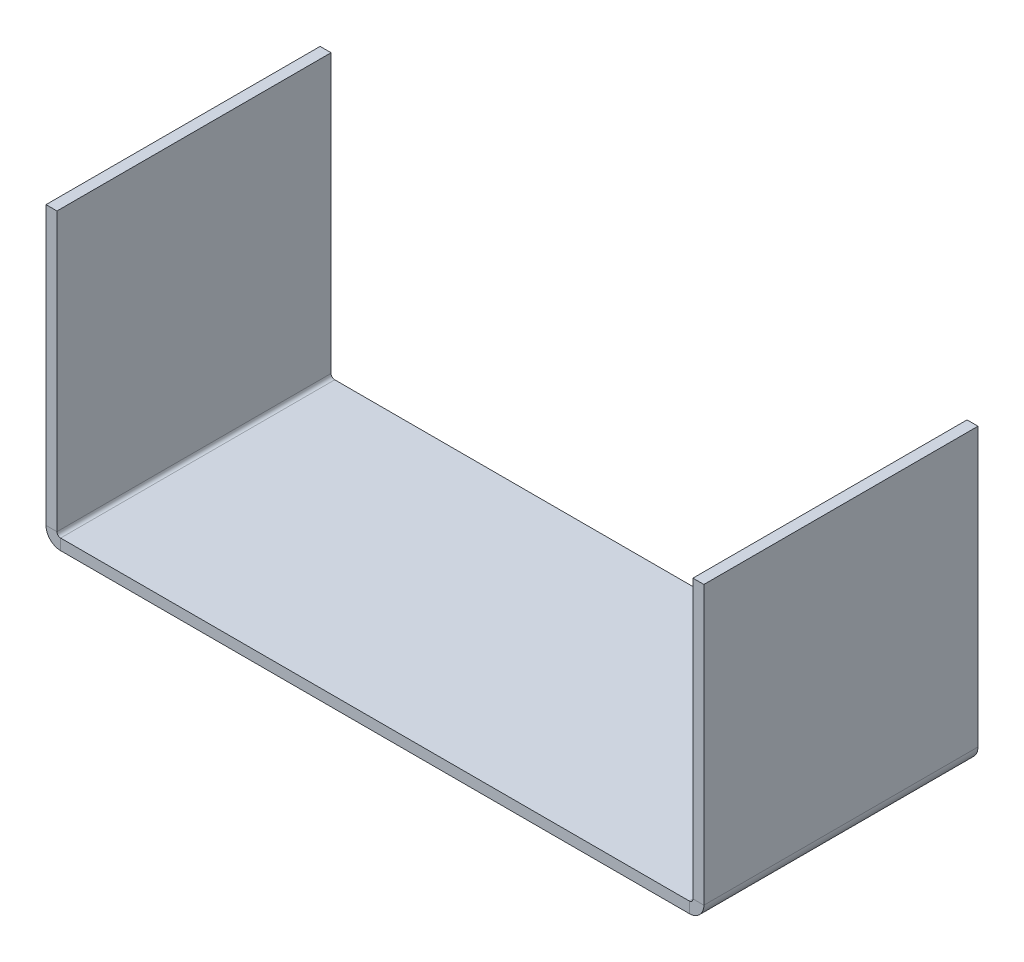
ISO-10303-21;
HEADER;
FILE_DESCRIPTION(('STEP AP214'),'2;1');
FILE_NAME('part.step','',(''),(''),'','','');
FILE_SCHEMA(('AUTOMOTIVE_DESIGN { 1 0 10303 214 1 1 1 1 }'));
ENDSEC;
DATA;
#1=APPLICATION_CONTEXT('core data for automotive mechanical design processes');
#2=APPLICATION_PROTOCOL_DEFINITION('international standard','automotive_design',2000,#1);
#3=PRODUCT_CONTEXT('',#1,'mechanical');
#4=PRODUCT('Part','Part','',(#3));
#5=PRODUCT_RELATED_PRODUCT_CATEGORY('part','',(#4));
#6=PRODUCT_DEFINITION_FORMATION('','',#4);
#7=PRODUCT_DEFINITION_CONTEXT('part definition',#1,'design');
#8=PRODUCT_DEFINITION('design','',#6,#7);
#9=PRODUCT_DEFINITION_SHAPE('','',#8);
#10=(LENGTH_UNIT() NAMED_UNIT(*) SI_UNIT(.MILLI.,.METRE.));
#11=(NAMED_UNIT(*) PLANE_ANGLE_UNIT() SI_UNIT($,.RADIAN.));
#12=(NAMED_UNIT(*) SI_UNIT($,.STERADIAN.) SOLID_ANGLE_UNIT());
#13=UNCERTAINTY_MEASURE_WITH_UNIT(LENGTH_MEASURE(1.E-05),#10,'distance_accuracy_value','');
#14=(GEOMETRIC_REPRESENTATION_CONTEXT(3) GLOBAL_UNCERTAINTY_ASSIGNED_CONTEXT((#13)) GLOBAL_UNIT_ASSIGNED_CONTEXT((#10,
#11,#12)) REPRESENTATION_CONTEXT('',''));
#15=CARTESIAN_POINT('',(0.,0.,0.));
#16=DIRECTION('',(0.,0.,1.));
#17=DIRECTION('',(1.,0.,0.));
#18=AXIS2_PLACEMENT_3D('',#15,#16,#17);
#19=CARTESIAN_POINT('',(-90.,4.,75.));
#20=DIRECTION('',(0.,0.,1.));
#21=DIRECTION('',(1.,0.,0.));
#22=AXIS2_PLACEMENT_3D('',#19,#20,#21);
#23=PLANE('',#22);
#24=DIRECTION('',(1.,0.,0.));
#25=VECTOR('',#24,1.);
#26=CARTESIAN_POINT('',(-90.,4.,75.));
#27=LINE('',#26,#25);
#28=CARTESIAN_POINT('',(-90.,4.,75.));
#29=VERTEX_POINT('',#28);
#30=CARTESIAN_POINT('',(-87.,4.,75.));
#31=VERTEX_POINT('',#30);
#32=EDGE_CURVE('E13',#29,#31,#27,.T.);
#33=ORIENTED_EDGE('',*,*,#32,.F.);
#34=CARTESIAN_POINT('',(-86.,4.,75.));
#35=DIRECTION('',(0.,0.,-1.));
#36=DIRECTION('',(-1.,0.,0.));
#37=AXIS2_PLACEMENT_3D('',#34,#35,#36);
#38=CIRCLE('',#37,4.);
#39=CARTESIAN_POINT('',(-85.9999999999999,0.,75.));
#40=VERTEX_POINT('',#39);
#41=EDGE_CURVE('E160',#29,#40,#38,.F.);
#42=ORIENTED_EDGE('',*,*,#41,.T.);
#43=DIRECTION('',(0.,-1.,0.));
#44=VECTOR('',#43,1.);
#45=CARTESIAN_POINT('',(-85.9999999999999,3.,75.));
#46=LINE('',#45,#44);
#47=CARTESIAN_POINT('',(-85.9999999999999,3.,75.));
#48=VERTEX_POINT('',#47);
#49=EDGE_CURVE('E58',#48,#40,#46,.T.);
#50=ORIENTED_EDGE('',*,*,#49,.F.);
#51=CARTESIAN_POINT('',(-86.,4.,75.));
#52=DIRECTION('',(0.,0.,1.));
#53=DIRECTION('',(1.,0.,0.));
#54=AXIS2_PLACEMENT_3D('',#51,#52,#53);
#55=CIRCLE('',#54,1.);
#56=EDGE_CURVE('E254',#31,#48,#55,.T.);
#57=ORIENTED_EDGE('',*,*,#56,.F.);
#58=EDGE_LOOP('',(#33,#42,#50,#57));
#59=FACE_BOUND('',#58,.T.);
#60=ADVANCED_FACE('F50',(#59),#23,.T.);
#61=CARTESIAN_POINT('',(-85.9999999999999,3.,75.));
#62=DIRECTION('',(0.,0.,1.));
#63=DIRECTION('',(1.,0.,0.));
#64=AXIS2_PLACEMENT_3D('',#61,#62,#63);
#65=PLANE('',#64);
#66=DIRECTION('',(0.,-1.,0.));
#67=VECTOR('',#66,1.);
#68=CARTESIAN_POINT('',(-90.,0.,75.));
#69=LINE('',#68,#67);
#70=CARTESIAN_POINT('',(-90.,80.,75.));
#71=VERTEX_POINT('',#70);
#72=EDGE_CURVE('E165',#71,#29,#69,.T.);
#73=ORIENTED_EDGE('',*,*,#72,.T.);
#74=ORIENTED_EDGE('',*,*,#32,.T.);
#75=DIRECTION('',(0.,1.,0.));
#76=VECTOR('',#75,1.);
#77=CARTESIAN_POINT('',(-87.,0.,75.));
#78=LINE('',#77,#76);
#79=CARTESIAN_POINT('',(-87.,80.,75.));
#80=VERTEX_POINT('',#79);
#81=EDGE_CURVE('E267',#80,#31,#78,.F.);
#82=ORIENTED_EDGE('',*,*,#81,.F.);
#83=DIRECTION('',(1.,0.,0.));
#84=VECTOR('',#83,1.);
#85=CARTESIAN_POINT('',(-90.,80.,75.));
#86=LINE('',#85,#84);
#87=EDGE_CURVE('E269',#71,#80,#86,.T.);
#88=ORIENTED_EDGE('',*,*,#87,.F.);
#89=EDGE_LOOP('',(#73,#74,#82,#88));
#90=FACE_BOUND('',#89,.T.);
#91=ADVANCED_FACE('F280',(#90),#65,.T.);
#92=CARTESIAN_POINT('',(-85.9999999999999,0.,0.));
#93=DIRECTION('',(0.,0.,-1.));
#94=DIRECTION('',(-1.,0.,0.));
#95=AXIS2_PLACEMENT_3D('',#92,#93,#94);
#96=PLANE('',#95);
#97=DIRECTION('',(0.,1.,0.));
#98=VECTOR('',#97,1.);
#99=CARTESIAN_POINT('',(-85.9999999999999,0.,0.));
#100=LINE('',#99,#98);
#101=CARTESIAN_POINT('',(-85.9999999999999,0.,0.));
#102=VERTEX_POINT('',#101);
#103=CARTESIAN_POINT('',(-85.9999999999999,3.,0.));
#104=VERTEX_POINT('',#103);
#105=EDGE_CURVE('E158',#102,#104,#100,.T.);
#106=ORIENTED_EDGE('',*,*,#105,.F.);
#107=CARTESIAN_POINT('',(-86.,4.,0.));
#108=DIRECTION('',(0.,0.,-1.));
#109=DIRECTION('',(-1.,0.,0.));
#110=AXIS2_PLACEMENT_3D('',#107,#108,#109);
#111=CIRCLE('',#110,4.);
#112=CARTESIAN_POINT('',(-90.,4.,0.));
#113=VERTEX_POINT('',#112);
#114=EDGE_CURVE('E172',#113,#102,#111,.F.);
#115=ORIENTED_EDGE('',*,*,#114,.F.);
#116=DIRECTION('',(-1.,0.,0.));
#117=VECTOR('',#116,1.);
#118=CARTESIAN_POINT('',(-87.,4.,0.));
#119=LINE('',#118,#117);
#120=CARTESIAN_POINT('',(-87.,4.,0.));
#121=VERTEX_POINT('',#120);
#122=EDGE_CURVE('E245',#121,#113,#119,.T.);
#123=ORIENTED_EDGE('',*,*,#122,.F.);
#124=CARTESIAN_POINT('',(-86.,4.,0.));
#125=DIRECTION('',(0.,0.,1.));
#126=DIRECTION('',(1.,0.,0.));
#127=AXIS2_PLACEMENT_3D('',#124,#125,#126);
#128=CIRCLE('',#127,1.);
#129=EDGE_CURVE('E199',#121,#104,#128,.T.);
#130=ORIENTED_EDGE('',*,*,#129,.T.);
#131=EDGE_LOOP('',(#106,#115,#123,#130));
#132=FACE_BOUND('',#131,.T.);
#133=ADVANCED_FACE('F259',(#132),#96,.T.);
#134=CARTESIAN_POINT('',(-87.,4.,0.));
#135=DIRECTION('',(0.,0.,-1.));
#136=DIRECTION('',(-1.,0.,0.));
#137=AXIS2_PLACEMENT_3D('',#134,#135,#136);
#138=PLANE('',#137);
#139=DIRECTION('',(1.,0.,0.));
#140=VECTOR('',#139,1.);
#141=CARTESIAN_POINT('',(90.,0.,0.));
#142=LINE('',#141,#140);
#143=CARTESIAN_POINT('',(86.,0.,0.));
#144=VERTEX_POINT('',#143);
#145=EDGE_CURVE('E212',#102,#144,#142,.T.);
#146=ORIENTED_EDGE('',*,*,#145,.F.);
#147=ORIENTED_EDGE('',*,*,#105,.T.);
#148=DIRECTION('',(1.,0.,0.));
#149=VECTOR('',#148,1.);
#150=CARTESIAN_POINT('',(90.,3.,0.));
#151=LINE('',#150,#149);
#152=CARTESIAN_POINT('',(86.,3.,0.));
#153=VERTEX_POINT('',#152);
#154=EDGE_CURVE('E197',#104,#153,#151,.T.);
#155=ORIENTED_EDGE('',*,*,#154,.T.);
#156=DIRECTION('',(0.,-1.,0.));
#157=VECTOR('',#156,1.);
#158=CARTESIAN_POINT('',(86.,3.,0.));
#159=LINE('',#158,#157);
#160=EDGE_CURVE('E107',#153,#144,#159,.T.);
#161=ORIENTED_EDGE('',*,*,#160,.T.);
#162=EDGE_LOOP('',(#146,#147,#155,#161));
#163=FACE_BOUND('',#162,.T.);
#164=ADVANCED_FACE('F247',(#163),#138,.T.);
#165=CARTESIAN_POINT('',(86.,0.,75.));
#166=DIRECTION('',(0.,0.,1.));
#167=DIRECTION('',(1.,0.,0.));
#168=AXIS2_PLACEMENT_3D('',#165,#166,#167);
#169=PLANE('',#168);
#170=DIRECTION('',(0.,1.,0.));
#171=VECTOR('',#170,1.);
#172=CARTESIAN_POINT('',(86.,0.,75.));
#173=LINE('',#172,#171);
#174=CARTESIAN_POINT('',(86.,0.,75.));
#175=VERTEX_POINT('',#174);
#176=CARTESIAN_POINT('',(86.,3.,75.));
#177=VERTEX_POINT('',#176);
#178=EDGE_CURVE('E243',#175,#177,#173,.T.);
#179=ORIENTED_EDGE('',*,*,#178,.F.);
#180=CARTESIAN_POINT('',(86.,4.,75.));
#181=DIRECTION('',(0.,0.,-1.));
#182=DIRECTION('',(-1.,0.,0.));
#183=AXIS2_PLACEMENT_3D('',#180,#181,#182);
#184=CIRCLE('',#183,4.);
#185=CARTESIAN_POINT('',(90.,4.,75.));
#186=VERTEX_POINT('',#185);
#187=EDGE_CURVE('E180',#175,#186,#184,.F.);
#188=ORIENTED_EDGE('',*,*,#187,.T.);
#189=DIRECTION('',(1.,0.,0.));
#190=VECTOR('',#189,1.);
#191=CARTESIAN_POINT('',(87.,4.,75.));
#192=LINE('',#191,#190);
#193=CARTESIAN_POINT('',(87.,4.,75.));
#194=VERTEX_POINT('',#193);
#195=EDGE_CURVE('E66',#194,#186,#192,.T.);
#196=ORIENTED_EDGE('',*,*,#195,.F.);
#197=CARTESIAN_POINT('',(86.,4.,75.));
#198=DIRECTION('',(0.,0.,1.));
#199=DIRECTION('',(1.,0.,0.));
#200=AXIS2_PLACEMENT_3D('',#197,#198,#199);
#201=CIRCLE('',#200,1.);
#202=EDGE_CURVE('E271',#177,#194,#201,.T.);
#203=ORIENTED_EDGE('',*,*,#202,.F.);
#204=EDGE_LOOP('',(#179,#188,#196,#203));
#205=FACE_BOUND('',#204,.T.);
#206=ADVANCED_FACE('F306',(#205),#169,.T.);
#207=CARTESIAN_POINT('',(87.,4.,75.));
#208=DIRECTION('',(0.,0.,1.));
#209=DIRECTION('',(1.,0.,0.));
#210=AXIS2_PLACEMENT_3D('',#207,#208,#209);
#211=PLANE('',#210);
#212=DIRECTION('',(1.,0.,0.));
#213=VECTOR('',#212,1.);
#214=CARTESIAN_POINT('',(90.,0.,75.));
#215=LINE('',#214,#213);
#216=EDGE_CURVE('E150',#40,#175,#215,.T.);
#217=ORIENTED_EDGE('',*,*,#216,.T.);
#218=ORIENTED_EDGE('',*,*,#178,.T.);
#219=DIRECTION('',(1.,0.,0.));
#220=VECTOR('',#219,1.);
#221=CARTESIAN_POINT('',(90.,3.,75.));
#222=LINE('',#221,#220);
#223=EDGE_CURVE('E153',#48,#177,#222,.T.);
#224=ORIENTED_EDGE('',*,*,#223,.F.);
#225=ORIENTED_EDGE('',*,*,#49,.T.);
#226=EDGE_LOOP('',(#217,#218,#224,#225));
#227=FACE_BOUND('',#226,.T.);
#228=ADVANCED_FACE('F148',(#227),#211,.T.);
#229=CARTESIAN_POINT('',(90.,4.,0.));
#230=DIRECTION('',(0.,0.,-1.));
#231=DIRECTION('',(-1.,0.,0.));
#232=AXIS2_PLACEMENT_3D('',#229,#230,#231);
#233=PLANE('',#232);
#234=DIRECTION('',(-1.,0.,0.));
#235=VECTOR('',#234,1.);
#236=CARTESIAN_POINT('',(90.,4.,0.));
#237=LINE('',#236,#235);
#238=CARTESIAN_POINT('',(90.,4.,0.));
#239=VERTEX_POINT('',#238);
#240=CARTESIAN_POINT('',(87.,4.,0.));
#241=VERTEX_POINT('',#240);
#242=EDGE_CURVE('E114',#239,#241,#237,.T.);
#243=ORIENTED_EDGE('',*,*,#242,.F.);
#244=CARTESIAN_POINT('',(86.,4.,0.));
#245=DIRECTION('',(0.,0.,-1.));
#246=DIRECTION('',(-1.,0.,0.));
#247=AXIS2_PLACEMENT_3D('',#244,#245,#246);
#248=CIRCLE('',#247,4.);
#249=EDGE_CURVE('E214',#144,#239,#248,.F.);
#250=ORIENTED_EDGE('',*,*,#249,.F.);
#251=ORIENTED_EDGE('',*,*,#160,.F.);
#252=CARTESIAN_POINT('',(86.,4.,0.));
#253=DIRECTION('',(0.,0.,1.));
#254=DIRECTION('',(1.,0.,0.));
#255=AXIS2_PLACEMENT_3D('',#252,#253,#254);
#256=CIRCLE('',#255,1.);
#257=EDGE_CURVE('E195',#153,#241,#256,.T.);
#258=ORIENTED_EDGE('',*,*,#257,.T.);
#259=EDGE_LOOP('',(#243,#250,#251,#258));
#260=FACE_BOUND('',#259,.T.);
#261=ADVANCED_FACE('F312',(#260),#233,.T.);
#262=CARTESIAN_POINT('',(86.,3.,0.));
#263=DIRECTION('',(0.,0.,-1.));
#264=DIRECTION('',(-1.,0.,0.));
#265=AXIS2_PLACEMENT_3D('',#262,#263,#264);
#266=PLANE('',#265);
#267=DIRECTION('',(0.,1.,0.));
#268=VECTOR('',#267,1.);
#269=CARTESIAN_POINT('',(90.,0.,0.));
#270=LINE('',#269,#268);
#271=CARTESIAN_POINT('',(90.,80.,0.));
#272=VERTEX_POINT('',#271);
#273=EDGE_CURVE('E186',#239,#272,#270,.T.);
#274=ORIENTED_EDGE('',*,*,#273,.F.);
#275=ORIENTED_EDGE('',*,*,#242,.T.);
#276=DIRECTION('',(0.,1.,0.));
#277=VECTOR('',#276,1.);
#278=CARTESIAN_POINT('',(87.,0.,0.));
#279=LINE('',#278,#277);
#280=CARTESIAN_POINT('',(87.,80.,0.));
#281=VERTEX_POINT('',#280);
#282=EDGE_CURVE('E192',#241,#281,#279,.T.);
#283=ORIENTED_EDGE('',*,*,#282,.T.);
#284=DIRECTION('',(1.,0.,0.));
#285=VECTOR('',#284,1.);
#286=CARTESIAN_POINT('',(87.,80.,0.));
#287=LINE('',#286,#285);
#288=EDGE_CURVE('E189',#281,#272,#287,.T.);
#289=ORIENTED_EDGE('',*,*,#288,.T.);
#290=EDGE_LOOP('',(#274,#275,#283,#289));
#291=FACE_BOUND('',#290,.T.);
#292=ADVANCED_FACE('F315',(#291),#266,.T.);
#293=CARTESIAN_POINT('',(90.,0.,75.));
#294=DIRECTION('',(-1.,0.,0.));
#295=DIRECTION('',(0.,0.,1.));
#296=AXIS2_PLACEMENT_3D('',#293,#294,#295);
#297=PLANE('',#296);
#298=ORIENTED_EDGE('',*,*,#273,.T.);
#299=DIRECTION('',(0.,0.,-1.));
#300=VECTOR('',#299,1.);
#301=CARTESIAN_POINT('',(90.,80.,75.));
#302=LINE('',#301,#300);
#303=CARTESIAN_POINT('',(90.,80.,75.));
#304=VERTEX_POINT('',#303);
#305=EDGE_CURVE('E238',#304,#272,#302,.T.);
#306=ORIENTED_EDGE('',*,*,#305,.F.);
#307=DIRECTION('',(0.,1.,0.));
#308=VECTOR('',#307,1.);
#309=CARTESIAN_POINT('',(90.,0.,75.));
#310=LINE('',#309,#308);
#311=EDGE_CURVE('E120',#186,#304,#310,.T.);
#312=ORIENTED_EDGE('',*,*,#311,.F.);
#313=DIRECTION('',(0.,0.,-1.));
#314=VECTOR('',#313,1.);
#315=CARTESIAN_POINT('',(90.,4.,75.));
#316=LINE('',#315,#314);
#317=EDGE_CURVE('E182',#186,#239,#316,.T.);
#318=ORIENTED_EDGE('',*,*,#317,.T.);
#319=EDGE_LOOP('',(#298,#306,#312,#318));
#320=FACE_BOUND('',#319,.T.);
#321=ADVANCED_FACE('F318',(#320),#297,.F.);
#322=CARTESIAN_POINT('',(87.,80.,75.));
#323=DIRECTION('',(0.,1.,0.));
#324=DIRECTION('',(0.,0.,1.));
#325=AXIS2_PLACEMENT_3D('',#322,#323,#324);
#326=PLANE('',#325);
#327=ORIENTED_EDGE('',*,*,#288,.F.);
#328=DIRECTION('',(0.,0.,-1.));
#329=VECTOR('',#328,1.);
#330=CARTESIAN_POINT('',(87.,80.,75.));
#331=LINE('',#330,#329);
#332=CARTESIAN_POINT('',(87.,80.,75.));
#333=VERTEX_POINT('',#332);
#334=EDGE_CURVE('E236',#333,#281,#331,.T.);
#335=ORIENTED_EDGE('',*,*,#334,.F.);
#336=DIRECTION('',(1.,0.,0.));
#337=VECTOR('',#336,1.);
#338=CARTESIAN_POINT('',(87.,80.,75.));
#339=LINE('',#338,#337);
#340=EDGE_CURVE('E526',#333,#304,#339,.T.);
#341=ORIENTED_EDGE('',*,*,#340,.T.);
#342=ORIENTED_EDGE('',*,*,#305,.T.);
#343=EDGE_LOOP('',(#327,#335,#341,#342));
#344=FACE_BOUND('',#343,.T.);
#345=ADVANCED_FACE('F322',(#344),#326,.T.);
#346=CARTESIAN_POINT('',(87.,0.,75.));
#347=DIRECTION('',(-1.,0.,0.));
#348=DIRECTION('',(0.,0.,1.));
#349=AXIS2_PLACEMENT_3D('',#346,#347,#348);
#350=PLANE('',#349);
#351=ORIENTED_EDGE('',*,*,#282,.F.);
#352=DIRECTION('',(0.,0.,-1.));
#353=VECTOR('',#352,1.);
#354=CARTESIAN_POINT('',(87.,4.,75.));
#355=LINE('',#354,#353);
#356=EDGE_CURVE('E233',#194,#241,#355,.T.);
#357=ORIENTED_EDGE('',*,*,#356,.F.);
#358=DIRECTION('',(0.,1.,0.));
#359=VECTOR('',#358,1.);
#360=CARTESIAN_POINT('',(87.,0.,75.));
#361=LINE('',#360,#359);
#362=EDGE_CURVE('E528',#194,#333,#361,.T.);
#363=ORIENTED_EDGE('',*,*,#362,.T.);
#364=ORIENTED_EDGE('',*,*,#334,.T.);
#365=EDGE_LOOP('',(#351,#357,#363,#364));
#366=FACE_BOUND('',#365,.T.);
#367=ADVANCED_FACE('F326',(#366),#350,.T.);
#368=CARTESIAN_POINT('',(86.,4.,75.));
#369=DIRECTION('',(0.,0.,-1.));
#370=DIRECTION('',(-1.,0.,0.));
#371=AXIS2_PLACEMENT_3D('',#368,#369,#370);
#372=CYLINDRICAL_SURFACE('',#371,1.);
#373=ORIENTED_EDGE('',*,*,#257,.F.);
#374=DIRECTION('',(0.,0.,-1.));
#375=VECTOR('',#374,1.);
#376=CARTESIAN_POINT('',(86.,3.,75.));
#377=LINE('',#376,#375);
#378=EDGE_CURVE('E230',#177,#153,#377,.T.);
#379=ORIENTED_EDGE('',*,*,#378,.F.);
#380=ORIENTED_EDGE('',*,*,#202,.T.);
#381=ORIENTED_EDGE('',*,*,#356,.T.);
#382=EDGE_LOOP('',(#373,#379,#380,#381));
#383=FACE_BOUND('',#382,.T.);
#384=ADVANCED_FACE('F330',(#383),#372,.F.);
#385=CARTESIAN_POINT('',(90.,3.,75.));
#386=DIRECTION('',(0.,1.,0.));
#387=DIRECTION('',(0.,0.,1.));
#388=AXIS2_PLACEMENT_3D('',#385,#386,#387);
#389=PLANE('',#388);
#390=ORIENTED_EDGE('',*,*,#154,.F.);
#391=DIRECTION('',(0.,0.,-1.));
#392=VECTOR('',#391,1.);
#393=CARTESIAN_POINT('',(-85.9999999999999,3.,75.));
#394=LINE('',#393,#392);
#395=EDGE_CURVE('E227',#48,#104,#394,.T.);
#396=ORIENTED_EDGE('',*,*,#395,.F.);
#397=ORIENTED_EDGE('',*,*,#223,.T.);
#398=ORIENTED_EDGE('',*,*,#378,.T.);
#399=EDGE_LOOP('',(#390,#396,#397,#398));
#400=FACE_BOUND('',#399,.T.);
#401=ADVANCED_FACE('F256',(#400),#389,.T.);
#402=CARTESIAN_POINT('',(-86.,4.,75.));
#403=DIRECTION('',(0.,0.,-1.));
#404=DIRECTION('',(-1.,0.,0.));
#405=AXIS2_PLACEMENT_3D('',#402,#403,#404);
#406=CYLINDRICAL_SURFACE('',#405,1.);
#407=ORIENTED_EDGE('',*,*,#129,.F.);
#408=DIRECTION('',(0.,0.,-1.));
#409=VECTOR('',#408,1.);
#410=CARTESIAN_POINT('',(-87.,4.,75.));
#411=LINE('',#410,#409);
#412=EDGE_CURVE('E224',#31,#121,#411,.T.);
#413=ORIENTED_EDGE('',*,*,#412,.F.);
#414=ORIENTED_EDGE('',*,*,#56,.T.);
#415=ORIENTED_EDGE('',*,*,#395,.T.);
#416=EDGE_LOOP('',(#407,#413,#414,#415));
#417=FACE_BOUND('',#416,.T.);
#418=ADVANCED_FACE('F252',(#417),#406,.F.);
#419=CARTESIAN_POINT('',(-87.,0.,75.));
#420=DIRECTION('',(1.,0.,0.));
#421=DIRECTION('',(0.,0.,-1.));
#422=AXIS2_PLACEMENT_3D('',#419,#420,#421);
#423=PLANE('',#422);
#424=DIRECTION('',(0.,1.,0.));
#425=VECTOR('',#424,1.);
#426=CARTESIAN_POINT('',(-87.,0.,0.));
#427=LINE('',#426,#425);
#428=CARTESIAN_POINT('',(-87.,80.,0.));
#429=VERTEX_POINT('',#428);
#430=EDGE_CURVE('E202',#429,#121,#427,.F.);
#431=ORIENTED_EDGE('',*,*,#430,.F.);
#432=DIRECTION('',(0.,0.,-1.));
#433=VECTOR('',#432,1.);
#434=CARTESIAN_POINT('',(-87.,80.,75.));
#435=LINE('',#434,#433);
#436=EDGE_CURVE('E222',#80,#429,#435,.T.);
#437=ORIENTED_EDGE('',*,*,#436,.F.);
#438=ORIENTED_EDGE('',*,*,#81,.T.);
#439=ORIENTED_EDGE('',*,*,#412,.T.);
#440=EDGE_LOOP('',(#431,#437,#438,#439));
#441=FACE_BOUND('',#440,.T.);
#442=ADVANCED_FACE('F265',(#441),#423,.T.);
#443=CARTESIAN_POINT('',(-90.,80.,75.));
#444=DIRECTION('',(0.,1.,0.));
#445=DIRECTION('',(0.,0.,1.));
#446=AXIS2_PLACEMENT_3D('',#443,#444,#445);
#447=PLANE('',#446);
#448=DIRECTION('',(1.,0.,0.));
#449=VECTOR('',#448,1.);
#450=CARTESIAN_POINT('',(-90.,80.,0.));
#451=LINE('',#450,#449);
#452=CARTESIAN_POINT('',(-90.,80.,0.));
#453=VERTEX_POINT('',#452);
#454=EDGE_CURVE('E205',#453,#429,#451,.T.);
#455=ORIENTED_EDGE('',*,*,#454,.F.);
#456=DIRECTION('',(0.,0.,-1.));
#457=VECTOR('',#456,1.);
#458=CARTESIAN_POINT('',(-90.,80.,75.));
#459=LINE('',#458,#457);
#460=EDGE_CURVE('E220',#71,#453,#459,.T.);
#461=ORIENTED_EDGE('',*,*,#460,.F.);
#462=ORIENTED_EDGE('',*,*,#87,.T.);
#463=ORIENTED_EDGE('',*,*,#436,.T.);
#464=EDGE_LOOP('',(#455,#461,#462,#463));
#465=FACE_BOUND('',#464,.T.);
#466=ADVANCED_FACE('F286',(#465),#447,.T.);
#467=CARTESIAN_POINT('',(-90.,0.,75.));
#468=DIRECTION('',(1.,0.,0.));
#469=DIRECTION('',(0.,0.,-1.));
#470=AXIS2_PLACEMENT_3D('',#467,#468,#469);
#471=PLANE('',#470);
#472=DIRECTION('',(0.,-1.,0.));
#473=VECTOR('',#472,1.);
#474=CARTESIAN_POINT('',(-90.,0.,0.));
#475=LINE('',#474,#473);
#476=EDGE_CURVE('E208',#453,#113,#475,.T.);
#477=ORIENTED_EDGE('',*,*,#476,.T.);
#478=DIRECTION('',(0.,0.,-1.));
#479=VECTOR('',#478,1.);
#480=CARTESIAN_POINT('',(-90.,4.,75.));
#481=LINE('',#480,#479);
#482=EDGE_CURVE('E174',#29,#113,#481,.T.);
#483=ORIENTED_EDGE('',*,*,#482,.F.);
#484=ORIENTED_EDGE('',*,*,#72,.F.);
#485=ORIENTED_EDGE('',*,*,#460,.T.);
#486=EDGE_LOOP('',(#477,#483,#484,#485));
#487=FACE_BOUND('',#486,.T.);
#488=ADVANCED_FACE('F282',(#487),#471,.F.);
#489=CARTESIAN_POINT('',(-86.,4.,75.));
#490=DIRECTION('',(0.,0.,-1.));
#491=DIRECTION('',(-1.,0.,0.));
#492=AXIS2_PLACEMENT_3D('',#489,#490,#491);
#493=CYLINDRICAL_SURFACE('',#492,4.);
#494=ORIENTED_EDGE('',*,*,#114,.T.);
#495=DIRECTION('',(0.,0.,-1.));
#496=VECTOR('',#495,1.);
#497=CARTESIAN_POINT('',(-85.9999999999999,0.,75.));
#498=LINE('',#497,#496);
#499=EDGE_CURVE('E169',#40,#102,#498,.T.);
#500=ORIENTED_EDGE('',*,*,#499,.F.);
#501=ORIENTED_EDGE('',*,*,#41,.F.);
#502=ORIENTED_EDGE('',*,*,#482,.T.);
#503=EDGE_LOOP('',(#494,#500,#501,#502));
#504=FACE_BOUND('',#503,.T.);
#505=ADVANCED_FACE('F170',(#504),#493,.T.);
#506=CARTESIAN_POINT('',(90.,0.,75.));
#507=DIRECTION('',(0.,1.,0.));
#508=DIRECTION('',(0.,0.,1.));
#509=AXIS2_PLACEMENT_3D('',#506,#507,#508);
#510=PLANE('',#509);
#511=ORIENTED_EDGE('',*,*,#145,.T.);
#512=DIRECTION('',(0.,0.,-1.));
#513=VECTOR('',#512,1.);
#514=CARTESIAN_POINT('',(86.,0.,75.));
#515=LINE('',#514,#513);
#516=EDGE_CURVE('E175',#175,#144,#515,.T.);
#517=ORIENTED_EDGE('',*,*,#516,.F.);
#518=ORIENTED_EDGE('',*,*,#216,.F.);
#519=ORIENTED_EDGE('',*,*,#499,.T.);
#520=EDGE_LOOP('',(#511,#517,#518,#519));
#521=FACE_BOUND('',#520,.T.);
#522=ADVANCED_FACE('F177',(#521),#510,.F.);
#523=CARTESIAN_POINT('',(86.,4.,75.));
#524=DIRECTION('',(0.,0.,-1.));
#525=DIRECTION('',(-1.,0.,0.));
#526=AXIS2_PLACEMENT_3D('',#523,#524,#525);
#527=CYLINDRICAL_SURFACE('',#526,4.);
#528=ORIENTED_EDGE('',*,*,#249,.T.);
#529=ORIENTED_EDGE('',*,*,#317,.F.);
#530=ORIENTED_EDGE('',*,*,#187,.F.);
#531=ORIENTED_EDGE('',*,*,#516,.T.);
#532=EDGE_LOOP('',(#528,#529,#530,#531));
#533=FACE_BOUND('',#532,.T.);
#534=ADVANCED_FACE('F377',(#533),#527,.T.);
#535=CARTESIAN_POINT('',(86.,4.,75.));
#536=DIRECTION('',(0.,0.,1.));
#537=DIRECTION('',(1.,0.,0.));
#538=AXIS2_PLACEMENT_3D('',#535,#536,#537);
#539=PLANE('',#538);
#540=ORIENTED_EDGE('',*,*,#311,.T.);
#541=ORIENTED_EDGE('',*,*,#340,.F.);
#542=ORIENTED_EDGE('',*,*,#362,.F.);
#543=ORIENTED_EDGE('',*,*,#195,.T.);
#544=EDGE_LOOP('',(#540,#541,#542,#543));
#545=FACE_BOUND('',#544,.T.);
#546=ADVANCED_FACE('F387',(#545),#539,.T.);
#547=CARTESIAN_POINT('',(86.,4.,0.));
#548=DIRECTION('',(0.,0.,1.));
#549=DIRECTION('',(1.,0.,0.));
#550=AXIS2_PLACEMENT_3D('',#547,#548,#549);
#551=PLANE('',#550);
#552=ORIENTED_EDGE('',*,*,#430,.T.);
#553=ORIENTED_EDGE('',*,*,#122,.T.);
#554=ORIENTED_EDGE('',*,*,#476,.F.);
#555=ORIENTED_EDGE('',*,*,#454,.T.);
#556=EDGE_LOOP('',(#552,#553,#554,#555));
#557=FACE_BOUND('',#556,.T.);
#558=ADVANCED_FACE('F284',(#557),#551,.F.);
#559=CLOSED_SHELL('',(#60,#91,#133,#164,#206,#228,#261,#292,#321,#345,#367,#384,#401,#418,#442,
#466,#488,#505,#522,#534,#546,#558));
#560=MANIFOLD_SOLID_BREP('B2',#559);
#561=ADVANCED_BREP_SHAPE_REPRESENTATION('',(#18,#560),#14);
#562=SHAPE_DEFINITION_REPRESENTATION(#9,#561);
ENDSEC;
END-ISO-10303-21;
